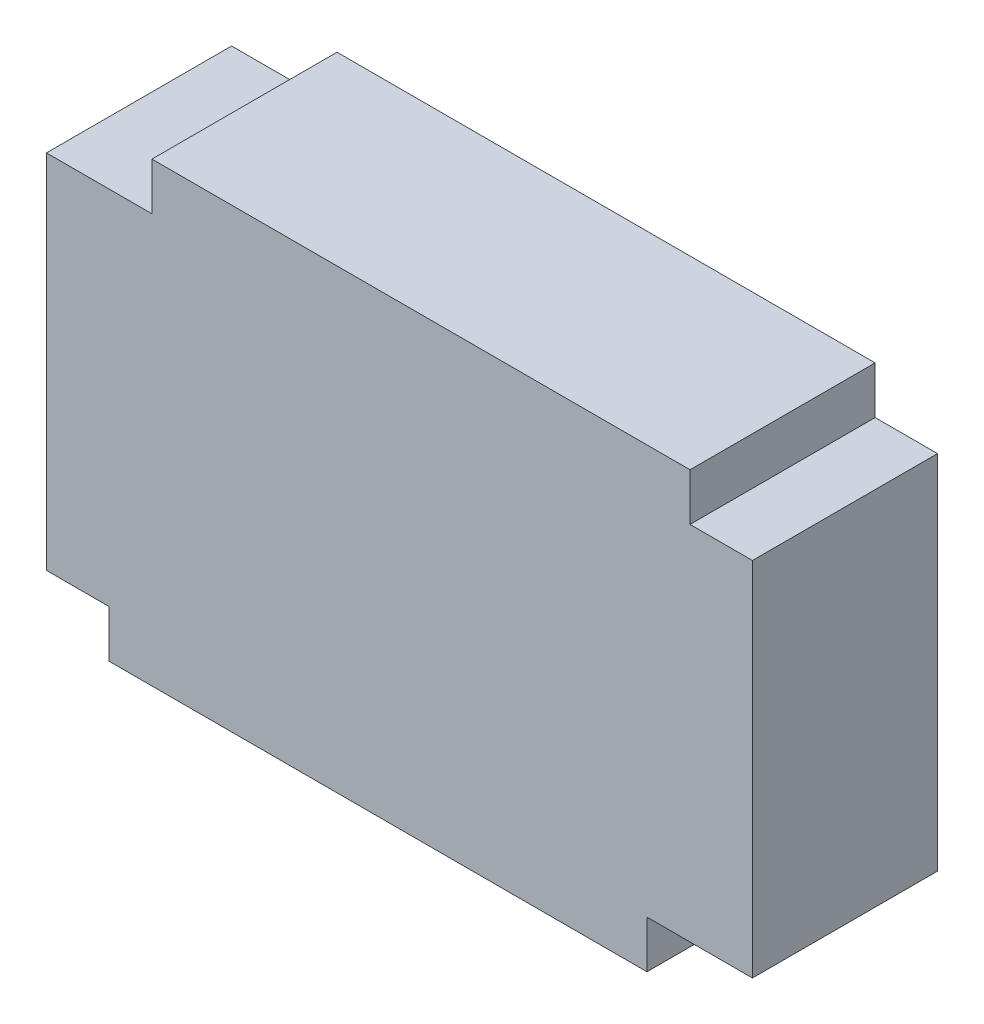
ISO-10303-21;
HEADER;
FILE_DESCRIPTION(('STEP AP214'),'2;1');
FILE_NAME('part.step','',(''),(''),'','','');
FILE_SCHEMA(('AUTOMOTIVE_DESIGN { 1 0 10303 214 1 1 1 1 }'));
ENDSEC;
DATA;
#1=APPLICATION_CONTEXT('core data for automotive mechanical design processes');
#2=APPLICATION_PROTOCOL_DEFINITION('international standard','automotive_design',2000,#1);
#3=PRODUCT_CONTEXT('',#1,'mechanical');
#4=PRODUCT('Part','Part','',(#3));
#5=PRODUCT_RELATED_PRODUCT_CATEGORY('part','',(#4));
#6=PRODUCT_DEFINITION_FORMATION('','',#4);
#7=PRODUCT_DEFINITION_CONTEXT('part definition',#1,'design');
#8=PRODUCT_DEFINITION('design','',#6,#7);
#9=PRODUCT_DEFINITION_SHAPE('','',#8);
#10=(LENGTH_UNIT() NAMED_UNIT(*) SI_UNIT(.MILLI.,.METRE.));
#11=(NAMED_UNIT(*) PLANE_ANGLE_UNIT() SI_UNIT($,.RADIAN.));
#12=(NAMED_UNIT(*) SI_UNIT($,.STERADIAN.) SOLID_ANGLE_UNIT());
#13=UNCERTAINTY_MEASURE_WITH_UNIT(LENGTH_MEASURE(1.E-05),#10,'distance_accuracy_value','');
#14=(GEOMETRIC_REPRESENTATION_CONTEXT(3) GLOBAL_UNCERTAINTY_ASSIGNED_CONTEXT((#13)) GLOBAL_UNIT_ASSIGNED_CONTEXT((#10,
#11,#12)) REPRESENTATION_CONTEXT('',''));
#15=CARTESIAN_POINT('',(0.,0.,0.));
#16=DIRECTION('',(0.,0.,1.));
#17=DIRECTION('',(1.,0.,0.));
#18=AXIS2_PLACEMENT_3D('',#15,#16,#17);
#19=CARTESIAN_POINT('',(-3.375,-2.65,2.15));
#20=DIRECTION('',(0.,1.,0.));
#21=DIRECTION('',(0.,0.,1.));
#22=AXIS2_PLACEMENT_3D('',#19,#20,#21);
#23=PLANE('',#22);
#24=DIRECTION('',(1.,0.,0.));
#25=VECTOR('',#24,1.);
#26=CARTESIAN_POINT('',(-3.375,-2.65,0.));
#27=LINE('',#26,#25);
#28=CARTESIAN_POINT('',(-3.375,-2.65,0.));
#29=VERTEX_POINT('',#28);
#30=CARTESIAN_POINT('',(2.875,-2.65,0.));
#31=VERTEX_POINT('',#30);
#32=EDGE_CURVE('E154',#29,#31,#27,.T.);
#33=ORIENTED_EDGE('',*,*,#32,.T.);
#34=DIRECTION('',(0.,0.,-1.));
#35=VECTOR('',#34,1.);
#36=CARTESIAN_POINT('',(2.875,-2.65,2.15));
#37=LINE('',#36,#35);
#38=CARTESIAN_POINT('',(2.875,-2.65,2.15));
#39=VERTEX_POINT('',#38);
#40=EDGE_CURVE('E11',#39,#31,#37,.T.);
#41=ORIENTED_EDGE('',*,*,#40,.F.);
#42=DIRECTION('',(1.,0.,0.));
#43=VECTOR('',#42,1.);
#44=CARTESIAN_POINT('',(-3.375,-2.65,2.15));
#45=LINE('',#44,#43);
#46=CARTESIAN_POINT('',(-3.375,-2.65,2.15));
#47=VERTEX_POINT('',#46);
#48=EDGE_CURVE('E176',#47,#39,#45,.T.);
#49=ORIENTED_EDGE('',*,*,#48,.F.);
#50=DIRECTION('',(0.,0.,-1.));
#51=VECTOR('',#50,1.);
#52=CARTESIAN_POINT('',(-3.375,-2.65,2.15));
#53=LINE('',#52,#51);
#54=EDGE_CURVE('E150',#47,#29,#53,.T.);
#55=ORIENTED_EDGE('',*,*,#54,.T.);
#56=EDGE_LOOP('',(#33,#41,#49,#55));
#57=FACE_BOUND('',#56,.T.);
#58=ADVANCED_FACE('F34',(#57),#23,.F.);
#59=CARTESIAN_POINT('',(2.875,-2.65,2.15));
#60=DIRECTION('',(-1.,0.,0.));
#61=DIRECTION('',(0.,0.,1.));
#62=AXIS2_PLACEMENT_3D('',#59,#60,#61);
#63=PLANE('',#62);
#64=DIRECTION('',(0.,1.,0.));
#65=VECTOR('',#64,1.);
#66=CARTESIAN_POINT('',(2.875,-2.65,0.));
#67=LINE('',#66,#65);
#68=CARTESIAN_POINT('',(2.875,-2.1,0.));
#69=VERTEX_POINT('',#68);
#70=EDGE_CURVE('E157',#31,#69,#67,.T.);
#71=ORIENTED_EDGE('',*,*,#70,.T.);
#72=DIRECTION('',(0.,0.,-1.));
#73=VECTOR('',#72,1.);
#74=CARTESIAN_POINT('',(2.875,-2.1,2.15));
#75=LINE('',#74,#73);
#76=CARTESIAN_POINT('',(2.875,-2.1,2.15));
#77=VERTEX_POINT('',#76);
#78=EDGE_CURVE('E42',#77,#69,#75,.T.);
#79=ORIENTED_EDGE('',*,*,#78,.F.);
#80=DIRECTION('',(0.,1.,0.));
#81=VECTOR('',#80,1.);
#82=CARTESIAN_POINT('',(2.875,-2.65,2.15));
#83=LINE('',#82,#81);
#84=EDGE_CURVE('E105',#39,#77,#83,.T.);
#85=ORIENTED_EDGE('',*,*,#84,.F.);
#86=ORIENTED_EDGE('',*,*,#40,.T.);
#87=EDGE_LOOP('',(#71,#79,#85,#86));
#88=FACE_BOUND('',#87,.T.);
#89=ADVANCED_FACE('F254',(#88),#63,.F.);
#90=CARTESIAN_POINT('',(2.875,-2.1,2.15));
#91=DIRECTION('',(0.,1.,0.));
#92=DIRECTION('',(0.,0.,1.));
#93=AXIS2_PLACEMENT_3D('',#90,#91,#92);
#94=PLANE('',#93);
#95=DIRECTION('',(1.,0.,0.));
#96=VECTOR('',#95,1.);
#97=CARTESIAN_POINT('',(2.875,-2.1,0.));
#98=LINE('',#97,#96);
#99=CARTESIAN_POINT('',(4.1,-2.1,0.));
#100=VERTEX_POINT('',#99);
#101=EDGE_CURVE('E159',#69,#100,#98,.T.);
#102=ORIENTED_EDGE('',*,*,#101,.T.);
#103=DIRECTION('',(0.,0.,-1.));
#104=VECTOR('',#103,1.);
#105=CARTESIAN_POINT('',(4.1,-2.1,2.15));
#106=LINE('',#105,#104);
#107=CARTESIAN_POINT('',(4.1,-2.1,2.15));
#108=VERTEX_POINT('',#107);
#109=EDGE_CURVE('E195',#108,#100,#106,.T.);
#110=ORIENTED_EDGE('',*,*,#109,.F.);
#111=DIRECTION('',(1.,0.,0.));
#112=VECTOR('',#111,1.);
#113=CARTESIAN_POINT('',(2.875,-2.1,2.15));
#114=LINE('',#113,#112);
#115=EDGE_CURVE('E203',#77,#108,#114,.T.);
#116=ORIENTED_EDGE('',*,*,#115,.F.);
#117=ORIENTED_EDGE('',*,*,#78,.T.);
#118=EDGE_LOOP('',(#102,#110,#116,#117));
#119=FACE_BOUND('',#118,.T.);
#120=ADVANCED_FACE('F201',(#119),#94,.F.);
#121=CARTESIAN_POINT('',(4.1,-2.1,2.15));
#122=DIRECTION('',(-1.,0.,0.));
#123=DIRECTION('',(0.,0.,1.));
#124=AXIS2_PLACEMENT_3D('',#121,#122,#123);
#125=PLANE('',#124);
#126=DIRECTION('',(0.,1.,0.));
#127=VECTOR('',#126,1.);
#128=CARTESIAN_POINT('',(4.1,-2.1,0.));
#129=LINE('',#128,#127);
#130=CARTESIAN_POINT('',(4.1,2.1,0.));
#131=VERTEX_POINT('',#130);
#132=EDGE_CURVE('E161',#100,#131,#129,.T.);
#133=ORIENTED_EDGE('',*,*,#132,.T.);
#134=DIRECTION('',(0.,0.,-1.));
#135=VECTOR('',#134,1.);
#136=CARTESIAN_POINT('',(4.1,2.1,2.15));
#137=LINE('',#136,#135);
#138=CARTESIAN_POINT('',(4.1,2.1,2.15));
#139=VERTEX_POINT('',#138);
#140=EDGE_CURVE('E192',#139,#131,#137,.T.);
#141=ORIENTED_EDGE('',*,*,#140,.F.);
#142=DIRECTION('',(0.,1.,0.));
#143=VECTOR('',#142,1.);
#144=CARTESIAN_POINT('',(4.1,-2.1,2.15));
#145=LINE('',#144,#143);
#146=EDGE_CURVE('E221',#108,#139,#145,.T.);
#147=ORIENTED_EDGE('',*,*,#146,.F.);
#148=ORIENTED_EDGE('',*,*,#109,.T.);
#149=EDGE_LOOP('',(#133,#141,#147,#148));
#150=FACE_BOUND('',#149,.T.);
#151=ADVANCED_FACE('F212',(#150),#125,.F.);
#152=CARTESIAN_POINT('',(4.1,2.1,2.15));
#153=DIRECTION('',(0.,-1.,0.));
#154=DIRECTION('',(0.,0.,-1.));
#155=AXIS2_PLACEMENT_3D('',#152,#153,#154);
#156=PLANE('',#155);
#157=DIRECTION('',(-1.,0.,0.));
#158=VECTOR('',#157,1.);
#159=CARTESIAN_POINT('',(4.1,2.1,0.));
#160=LINE('',#159,#158);
#161=CARTESIAN_POINT('',(3.375,2.1,0.));
#162=VERTEX_POINT('',#161);
#163=EDGE_CURVE('E163',#131,#162,#160,.T.);
#164=ORIENTED_EDGE('',*,*,#163,.T.);
#165=DIRECTION('',(0.,0.,-1.));
#166=VECTOR('',#165,1.);
#167=CARTESIAN_POINT('',(3.375,2.1,2.15));
#168=LINE('',#167,#166);
#169=CARTESIAN_POINT('',(3.375,2.1,2.15));
#170=VERTEX_POINT('',#169);
#171=EDGE_CURVE('E189',#170,#162,#168,.T.);
#172=ORIENTED_EDGE('',*,*,#171,.F.);
#173=DIRECTION('',(-1.,0.,0.));
#174=VECTOR('',#173,1.);
#175=CARTESIAN_POINT('',(4.1,2.1,2.15));
#176=LINE('',#175,#174);
#177=EDGE_CURVE('E218',#139,#170,#176,.T.);
#178=ORIENTED_EDGE('',*,*,#177,.F.);
#179=ORIENTED_EDGE('',*,*,#140,.T.);
#180=EDGE_LOOP('',(#164,#172,#178,#179));
#181=FACE_BOUND('',#180,.T.);
#182=ADVANCED_FACE('F216',(#181),#156,.F.);
#183=CARTESIAN_POINT('',(3.375,2.1,2.15));
#184=DIRECTION('',(-1.,0.,0.));
#185=DIRECTION('',(0.,0.,1.));
#186=AXIS2_PLACEMENT_3D('',#183,#184,#185);
#187=PLANE('',#186);
#188=DIRECTION('',(0.,1.,0.));
#189=VECTOR('',#188,1.);
#190=CARTESIAN_POINT('',(3.375,2.1,0.));
#191=LINE('',#190,#189);
#192=CARTESIAN_POINT('',(3.375,2.65,0.));
#193=VERTEX_POINT('',#192);
#194=EDGE_CURVE('E165',#162,#193,#191,.T.);
#195=ORIENTED_EDGE('',*,*,#194,.T.);
#196=DIRECTION('',(0.,0.,-1.));
#197=VECTOR('',#196,1.);
#198=CARTESIAN_POINT('',(3.375,2.65,2.15));
#199=LINE('',#198,#197);
#200=CARTESIAN_POINT('',(3.375,2.65,2.15));
#201=VERTEX_POINT('',#200);
#202=EDGE_CURVE('E186',#201,#193,#199,.T.);
#203=ORIENTED_EDGE('',*,*,#202,.F.);
#204=DIRECTION('',(0.,1.,0.));
#205=VECTOR('',#204,1.);
#206=CARTESIAN_POINT('',(3.375,2.1,2.15));
#207=LINE('',#206,#205);
#208=EDGE_CURVE('E220',#170,#201,#207,.T.);
#209=ORIENTED_EDGE('',*,*,#208,.F.);
#210=ORIENTED_EDGE('',*,*,#171,.T.);
#211=EDGE_LOOP('',(#195,#203,#209,#210));
#212=FACE_BOUND('',#211,.T.);
#213=ADVANCED_FACE('F267',(#212),#187,.F.);
#214=CARTESIAN_POINT('',(3.375,2.65,2.15));
#215=DIRECTION('',(0.,-1.,0.));
#216=DIRECTION('',(0.,0.,-1.));
#217=AXIS2_PLACEMENT_3D('',#214,#215,#216);
#218=PLANE('',#217);
#219=DIRECTION('',(-1.,0.,0.));
#220=VECTOR('',#219,1.);
#221=CARTESIAN_POINT('',(3.375,2.65,0.));
#222=LINE('',#221,#220);
#223=CARTESIAN_POINT('',(-2.875,2.65,0.));
#224=VERTEX_POINT('',#223);
#225=EDGE_CURVE('E167',#193,#224,#222,.T.);
#226=ORIENTED_EDGE('',*,*,#225,.T.);
#227=DIRECTION('',(0.,0.,-1.));
#228=VECTOR('',#227,1.);
#229=CARTESIAN_POINT('',(-2.875,2.65,2.15));
#230=LINE('',#229,#228);
#231=CARTESIAN_POINT('',(-2.875,2.65,2.15));
#232=VERTEX_POINT('',#231);
#233=EDGE_CURVE('E183',#232,#224,#230,.T.);
#234=ORIENTED_EDGE('',*,*,#233,.F.);
#235=DIRECTION('',(-1.,0.,0.));
#236=VECTOR('',#235,1.);
#237=CARTESIAN_POINT('',(3.375,2.65,2.15));
#238=LINE('',#237,#236);
#239=EDGE_CURVE('E223',#201,#232,#238,.T.);
#240=ORIENTED_EDGE('',*,*,#239,.F.);
#241=ORIENTED_EDGE('',*,*,#202,.T.);
#242=EDGE_LOOP('',(#226,#234,#240,#241));
#243=FACE_BOUND('',#242,.T.);
#244=ADVANCED_FACE('F270',(#243),#218,.F.);
#245=CARTESIAN_POINT('',(-2.875,2.65,2.15));
#246=DIRECTION('',(1.,0.,0.));
#247=DIRECTION('',(0.,0.,-1.));
#248=AXIS2_PLACEMENT_3D('',#245,#246,#247);
#249=PLANE('',#248);
#250=DIRECTION('',(0.,-1.,0.));
#251=VECTOR('',#250,1.);
#252=CARTESIAN_POINT('',(-2.875,2.65,0.));
#253=LINE('',#252,#251);
#254=CARTESIAN_POINT('',(-2.875,2.1,0.));
#255=VERTEX_POINT('',#254);
#256=EDGE_CURVE('E169',#224,#255,#253,.T.);
#257=ORIENTED_EDGE('',*,*,#256,.T.);
#258=DIRECTION('',(0.,0.,-1.));
#259=VECTOR('',#258,1.);
#260=CARTESIAN_POINT('',(-2.875,2.1,2.15));
#261=LINE('',#260,#259);
#262=CARTESIAN_POINT('',(-2.875,2.1,2.15));
#263=VERTEX_POINT('',#262);
#264=EDGE_CURVE('E180',#263,#255,#261,.T.);
#265=ORIENTED_EDGE('',*,*,#264,.F.);
#266=DIRECTION('',(0.,-1.,0.));
#267=VECTOR('',#266,1.);
#268=CARTESIAN_POINT('',(-2.875,2.65,2.15));
#269=LINE('',#268,#267);
#270=EDGE_CURVE('E229',#232,#263,#269,.T.);
#271=ORIENTED_EDGE('',*,*,#270,.F.);
#272=ORIENTED_EDGE('',*,*,#233,.T.);
#273=EDGE_LOOP('',(#257,#265,#271,#272));
#274=FACE_BOUND('',#273,.T.);
#275=ADVANCED_FACE('F235',(#274),#249,.F.);
#276=CARTESIAN_POINT('',(-2.875,2.1,2.15));
#277=DIRECTION('',(0.,-1.,0.));
#278=DIRECTION('',(0.,0.,-1.));
#279=AXIS2_PLACEMENT_3D('',#276,#277,#278);
#280=PLANE('',#279);
#281=DIRECTION('',(-1.,0.,0.));
#282=VECTOR('',#281,1.);
#283=CARTESIAN_POINT('',(-2.875,2.1,0.));
#284=LINE('',#283,#282);
#285=CARTESIAN_POINT('',(-4.1,2.1,0.));
#286=VERTEX_POINT('',#285);
#287=EDGE_CURVE('E171',#255,#286,#284,.T.);
#288=ORIENTED_EDGE('',*,*,#287,.T.);
#289=DIRECTION('',(0.,0.,-1.));
#290=VECTOR('',#289,1.);
#291=CARTESIAN_POINT('',(-4.1,2.1,2.15));
#292=LINE('',#291,#290);
#293=CARTESIAN_POINT('',(-4.1,2.1,2.15));
#294=VERTEX_POINT('',#293);
#295=EDGE_CURVE('E145',#294,#286,#292,.T.);
#296=ORIENTED_EDGE('',*,*,#295,.F.);
#297=DIRECTION('',(-1.,0.,0.));
#298=VECTOR('',#297,1.);
#299=CARTESIAN_POINT('',(-2.875,2.1,2.15));
#300=LINE('',#299,#298);
#301=EDGE_CURVE('E136',#263,#294,#300,.T.);
#302=ORIENTED_EDGE('',*,*,#301,.F.);
#303=ORIENTED_EDGE('',*,*,#264,.T.);
#304=EDGE_LOOP('',(#288,#296,#302,#303));
#305=FACE_BOUND('',#304,.T.);
#306=ADVANCED_FACE('F239',(#305),#280,.F.);
#307=CARTESIAN_POINT('',(-4.1,2.1,2.15));
#308=DIRECTION('',(1.,0.,0.));
#309=DIRECTION('',(0.,0.,-1.));
#310=AXIS2_PLACEMENT_3D('',#307,#308,#309);
#311=PLANE('',#310);
#312=DIRECTION('',(0.,-1.,0.));
#313=VECTOR('',#312,1.);
#314=CARTESIAN_POINT('',(-4.1,2.1,0.));
#315=LINE('',#314,#313);
#316=CARTESIAN_POINT('',(-4.1,-2.1,0.));
#317=VERTEX_POINT('',#316);
#318=EDGE_CURVE('E144',#286,#317,#315,.T.);
#319=ORIENTED_EDGE('',*,*,#318,.T.);
#320=DIRECTION('',(0.,0.,-1.));
#321=VECTOR('',#320,1.);
#322=CARTESIAN_POINT('',(-4.1,-2.1,2.15));
#323=LINE('',#322,#321);
#324=CARTESIAN_POINT('',(-4.1,-2.1,2.15));
#325=VERTEX_POINT('',#324);
#326=EDGE_CURVE('E141',#325,#317,#323,.T.);
#327=ORIENTED_EDGE('',*,*,#326,.F.);
#328=DIRECTION('',(0.,-1.,0.));
#329=VECTOR('',#328,1.);
#330=CARTESIAN_POINT('',(-4.1,2.1,2.15));
#331=LINE('',#330,#329);
#332=EDGE_CURVE('E130',#294,#325,#331,.T.);
#333=ORIENTED_EDGE('',*,*,#332,.F.);
#334=ORIENTED_EDGE('',*,*,#295,.T.);
#335=EDGE_LOOP('',(#319,#327,#333,#334));
#336=FACE_BOUND('',#335,.T.);
#337=ADVANCED_FACE('F142',(#336),#311,.F.);
#338=CARTESIAN_POINT('',(-4.1,-2.1,2.15));
#339=DIRECTION('',(0.,1.,0.));
#340=DIRECTION('',(0.,0.,1.));
#341=AXIS2_PLACEMENT_3D('',#338,#339,#340);
#342=PLANE('',#341);
#343=DIRECTION('',(1.,0.,0.));
#344=VECTOR('',#343,1.);
#345=CARTESIAN_POINT('',(-4.1,-2.1,0.));
#346=LINE('',#345,#344);
#347=CARTESIAN_POINT('',(-3.375,-2.1,0.));
#348=VERTEX_POINT('',#347);
#349=EDGE_CURVE('E91',#317,#348,#346,.T.);
#350=ORIENTED_EDGE('',*,*,#349,.T.);
#351=DIRECTION('',(0.,0.,-1.));
#352=VECTOR('',#351,1.);
#353=CARTESIAN_POINT('',(-3.375,-2.1,2.15));
#354=LINE('',#353,#352);
#355=CARTESIAN_POINT('',(-3.375,-2.1,2.15));
#356=VERTEX_POINT('',#355);
#357=EDGE_CURVE('E146',#356,#348,#354,.T.);
#358=ORIENTED_EDGE('',*,*,#357,.F.);
#359=DIRECTION('',(1.,0.,0.));
#360=VECTOR('',#359,1.);
#361=CARTESIAN_POINT('',(-4.1,-2.1,2.15));
#362=LINE('',#361,#360);
#363=EDGE_CURVE('E134',#325,#356,#362,.T.);
#364=ORIENTED_EDGE('',*,*,#363,.F.);
#365=ORIENTED_EDGE('',*,*,#326,.T.);
#366=EDGE_LOOP('',(#350,#358,#364,#365));
#367=FACE_BOUND('',#366,.T.);
#368=ADVANCED_FACE('F148',(#367),#342,.F.);
#369=CARTESIAN_POINT('',(-3.375,-2.1,2.15));
#370=DIRECTION('',(1.,0.,0.));
#371=DIRECTION('',(0.,0.,-1.));
#372=AXIS2_PLACEMENT_3D('',#369,#370,#371);
#373=PLANE('',#372);
#374=DIRECTION('',(0.,-1.,0.));
#375=VECTOR('',#374,1.);
#376=CARTESIAN_POINT('',(-3.375,-2.1,0.));
#377=LINE('',#376,#375);
#378=EDGE_CURVE('E97',#348,#29,#377,.T.);
#379=ORIENTED_EDGE('',*,*,#378,.T.);
#380=ORIENTED_EDGE('',*,*,#54,.F.);
#381=DIRECTION('',(0.,-1.,0.));
#382=VECTOR('',#381,1.);
#383=CARTESIAN_POINT('',(-3.375,-2.1,2.15));
#384=LINE('',#383,#382);
#385=EDGE_CURVE('E50',#356,#47,#384,.T.);
#386=ORIENTED_EDGE('',*,*,#385,.F.);
#387=ORIENTED_EDGE('',*,*,#357,.T.);
#388=EDGE_LOOP('',(#379,#380,#386,#387));
#389=FACE_BOUND('',#388,.T.);
#390=ADVANCED_FACE('F243',(#389),#373,.F.);
#391=CARTESIAN_POINT('',(0.,0.,2.15));
#392=DIRECTION('',(0.,0.,1.));
#393=DIRECTION('',(1.,0.,0.));
#394=AXIS2_PLACEMENT_3D('',#391,#392,#393);
#395=PLANE('',#394);
#396=ORIENTED_EDGE('',*,*,#48,.T.);
#397=ORIENTED_EDGE('',*,*,#84,.T.);
#398=ORIENTED_EDGE('',*,*,#115,.T.);
#399=ORIENTED_EDGE('',*,*,#146,.T.);
#400=ORIENTED_EDGE('',*,*,#177,.T.);
#401=ORIENTED_EDGE('',*,*,#208,.T.);
#402=ORIENTED_EDGE('',*,*,#239,.T.);
#403=ORIENTED_EDGE('',*,*,#270,.T.);
#404=ORIENTED_EDGE('',*,*,#301,.T.);
#405=ORIENTED_EDGE('',*,*,#332,.T.);
#406=ORIENTED_EDGE('',*,*,#363,.T.);
#407=ORIENTED_EDGE('',*,*,#385,.T.);
#408=EDGE_LOOP('',(#396,#397,#398,#399,#400,#401,#402,#403,#404,#405,#406,#407));
#409=FACE_BOUND('',#408,.T.);
#410=ADVANCED_FACE('F132',(#409),#395,.T.);
#411=CARTESIAN_POINT('',(0.,0.,0.));
#412=DIRECTION('',(0.,0.,1.));
#413=DIRECTION('',(1.,0.,0.));
#414=AXIS2_PLACEMENT_3D('',#411,#412,#413);
#415=PLANE('',#414);
#416=ORIENTED_EDGE('',*,*,#32,.F.);
#417=ORIENTED_EDGE('',*,*,#378,.F.);
#418=ORIENTED_EDGE('',*,*,#349,.F.);
#419=ORIENTED_EDGE('',*,*,#318,.F.);
#420=ORIENTED_EDGE('',*,*,#287,.F.);
#421=ORIENTED_EDGE('',*,*,#256,.F.);
#422=ORIENTED_EDGE('',*,*,#225,.F.);
#423=ORIENTED_EDGE('',*,*,#194,.F.);
#424=ORIENTED_EDGE('',*,*,#163,.F.);
#425=ORIENTED_EDGE('',*,*,#132,.F.);
#426=ORIENTED_EDGE('',*,*,#101,.F.);
#427=ORIENTED_EDGE('',*,*,#70,.F.);
#428=EDGE_LOOP('',(#416,#417,#418,#419,#420,#421,#422,#423,#424,#425,#426,#427));
#429=FACE_BOUND('',#428,.T.);
#430=ADVANCED_FACE('F207',(#429),#415,.F.);
#431=CLOSED_SHELL('',(#58,#89,#120,#151,#182,#213,#244,#275,#306,#337,#368,#390,#410,#430));
#432=MANIFOLD_SOLID_BREP('B2',#431);
#433=ADVANCED_BREP_SHAPE_REPRESENTATION('',(#18,#432),#14);
#434=SHAPE_DEFINITION_REPRESENTATION(#9,#433);
ENDSEC;
END-ISO-10303-21;
